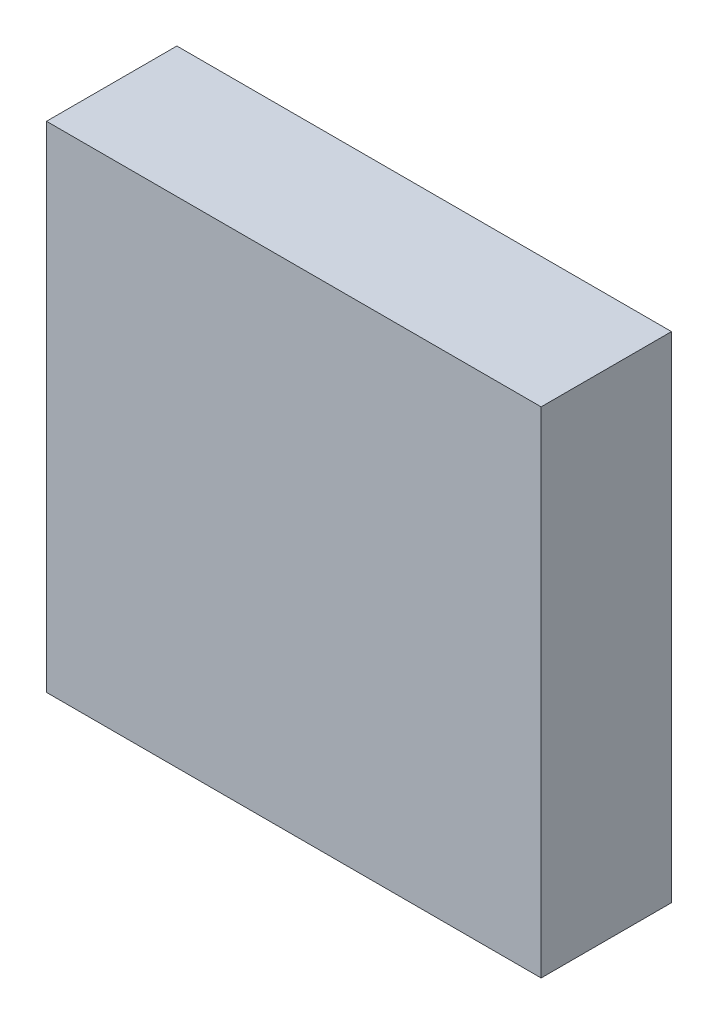
ISO-10303-21;
HEADER;
FILE_DESCRIPTION(('STEP AP214'),'2;1');
FILE_NAME('part.step','',(''),(''),'','','');
FILE_SCHEMA(('AUTOMOTIVE_DESIGN { 1 0 10303 214 1 1 1 1 }'));
ENDSEC;
DATA;
#1=APPLICATION_CONTEXT('core data for automotive mechanical design processes');
#2=APPLICATION_PROTOCOL_DEFINITION('international standard','automotive_design',2000,#1);
#3=PRODUCT_CONTEXT('',#1,'mechanical');
#4=PRODUCT('Part','Part','',(#3));
#5=PRODUCT_RELATED_PRODUCT_CATEGORY('part','',(#4));
#6=PRODUCT_DEFINITION_FORMATION('','',#4);
#7=PRODUCT_DEFINITION_CONTEXT('part definition',#1,'design');
#8=PRODUCT_DEFINITION('design','',#6,#7);
#9=PRODUCT_DEFINITION_SHAPE('','',#8);
#10=(LENGTH_UNIT() NAMED_UNIT(*) SI_UNIT(.MILLI.,.METRE.));
#11=(NAMED_UNIT(*) PLANE_ANGLE_UNIT() SI_UNIT($,.RADIAN.));
#12=(NAMED_UNIT(*) SI_UNIT($,.STERADIAN.) SOLID_ANGLE_UNIT());
#13=UNCERTAINTY_MEASURE_WITH_UNIT(LENGTH_MEASURE(1.E-05),#10,'distance_accuracy_value','');
#14=(GEOMETRIC_REPRESENTATION_CONTEXT(3) GLOBAL_UNCERTAINTY_ASSIGNED_CONTEXT((#13)) GLOBAL_UNIT_ASSIGNED_CONTEXT((#10,
#11,#12)) REPRESENTATION_CONTEXT('',''));
#15=CARTESIAN_POINT('',(0.,0.,0.));
#16=DIRECTION('',(0.,0.,1.));
#17=DIRECTION('',(1.,0.,0.));
#18=AXIS2_PLACEMENT_3D('',#15,#16,#17);
#19=CARTESIAN_POINT('',(0.,0.,1.));
#20=DIRECTION('',(1.,0.,0.));
#21=DIRECTION('',(0.,0.,-1.));
#22=AXIS2_PLACEMENT_3D('',#19,#20,#21);
#23=PLANE('',#22);
#24=DIRECTION('',(0.,-1.,0.));
#25=VECTOR('',#24,1.);
#26=CARTESIAN_POINT('',(0.,0.,0.));
#27=LINE('',#26,#25);
#28=CARTESIAN_POINT('',(0.,3.7941,0.));
#29=VERTEX_POINT('',#28);
#30=CARTESIAN_POINT('',(0.,0.,0.));
#31=VERTEX_POINT('',#30);
#32=EDGE_CURVE('E95',#29,#31,#27,.T.);
#33=ORIENTED_EDGE('',*,*,#32,.T.);
#34=DIRECTION('',(0.,0.,-1.));
#35=VECTOR('',#34,1.);
#36=CARTESIAN_POINT('',(0.,0.,1.));
#37=LINE('',#36,#35);
#38=CARTESIAN_POINT('',(0.,0.,1.));
#39=VERTEX_POINT('',#38);
#40=EDGE_CURVE('E11',#39,#31,#37,.T.);
#41=ORIENTED_EDGE('',*,*,#40,.F.);
#42=DIRECTION('',(0.,-1.,0.));
#43=VECTOR('',#42,1.);
#44=CARTESIAN_POINT('',(0.,0.,1.));
#45=LINE('',#44,#43);
#46=CARTESIAN_POINT('',(0.,3.7941,1.));
#47=VERTEX_POINT('',#46);
#48=EDGE_CURVE('E83',#47,#39,#45,.T.);
#49=ORIENTED_EDGE('',*,*,#48,.F.);
#50=DIRECTION('',(0.,0.,-1.));
#51=VECTOR('',#50,1.);
#52=CARTESIAN_POINT('',(0.,3.7941,1.));
#53=LINE('',#52,#51);
#54=EDGE_CURVE('E91',#47,#29,#53,.T.);
#55=ORIENTED_EDGE('',*,*,#54,.T.);
#56=EDGE_LOOP('',(#33,#41,#49,#55));
#57=FACE_BOUND('',#56,.T.);
#58=ADVANCED_FACE('F32',(#57),#23,.F.);
#59=CARTESIAN_POINT('',(3.7941,0.,1.));
#60=DIRECTION('',(0.,1.,0.));
#61=DIRECTION('',(0.,0.,1.));
#62=AXIS2_PLACEMENT_3D('',#59,#60,#61);
#63=PLANE('',#62);
#64=DIRECTION('',(1.,0.,0.));
#65=VECTOR('',#64,1.);
#66=CARTESIAN_POINT('',(3.7941,0.,0.));
#67=LINE('',#66,#65);
#68=CARTESIAN_POINT('',(3.7941,0.,0.));
#69=VERTEX_POINT('',#68);
#70=EDGE_CURVE('E87',#31,#69,#67,.T.);
#71=ORIENTED_EDGE('',*,*,#70,.T.);
#72=DIRECTION('',(0.,0.,-1.));
#73=VECTOR('',#72,1.);
#74=CARTESIAN_POINT('',(3.7941,0.,1.));
#75=LINE('',#74,#73);
#76=CARTESIAN_POINT('',(3.7941,0.,1.));
#77=VERTEX_POINT('',#76);
#78=EDGE_CURVE('E40',#77,#69,#75,.T.);
#79=ORIENTED_EDGE('',*,*,#78,.F.);
#80=DIRECTION('',(1.,0.,0.));
#81=VECTOR('',#80,1.);
#82=CARTESIAN_POINT('',(3.7941,0.,1.));
#83=LINE('',#82,#81);
#84=EDGE_CURVE('E78',#39,#77,#83,.T.);
#85=ORIENTED_EDGE('',*,*,#84,.F.);
#86=ORIENTED_EDGE('',*,*,#40,.T.);
#87=EDGE_LOOP('',(#71,#79,#85,#86));
#88=FACE_BOUND('',#87,.T.);
#89=ADVANCED_FACE('F86',(#88),#63,.F.);
#90=CARTESIAN_POINT('',(3.7941,3.7941,1.));
#91=DIRECTION('',(-1.,0.,0.));
#92=DIRECTION('',(0.,0.,1.));
#93=AXIS2_PLACEMENT_3D('',#90,#91,#92);
#94=PLANE('',#93);
#95=DIRECTION('',(0.,1.,0.));
#96=VECTOR('',#95,1.);
#97=CARTESIAN_POINT('',(3.7941,3.7941,0.));
#98=LINE('',#97,#96);
#99=CARTESIAN_POINT('',(3.7941,3.7941,0.));
#100=VERTEX_POINT('',#99);
#101=EDGE_CURVE('E65',#69,#100,#98,.T.);
#102=ORIENTED_EDGE('',*,*,#101,.T.);
#103=DIRECTION('',(0.,0.,-1.));
#104=VECTOR('',#103,1.);
#105=CARTESIAN_POINT('',(3.7941,3.7941,1.));
#106=LINE('',#105,#104);
#107=CARTESIAN_POINT('',(3.7941,3.7941,1.));
#108=VERTEX_POINT('',#107);
#109=EDGE_CURVE('E88',#108,#100,#106,.T.);
#110=ORIENTED_EDGE('',*,*,#109,.F.);
#111=DIRECTION('',(0.,1.,0.));
#112=VECTOR('',#111,1.);
#113=CARTESIAN_POINT('',(3.7941,3.7941,1.));
#114=LINE('',#113,#112);
#115=EDGE_CURVE('E81',#77,#108,#114,.T.);
#116=ORIENTED_EDGE('',*,*,#115,.F.);
#117=ORIENTED_EDGE('',*,*,#78,.T.);
#118=EDGE_LOOP('',(#102,#110,#116,#117));
#119=FACE_BOUND('',#118,.T.);
#120=ADVANCED_FACE('F89',(#119),#94,.F.);
#121=CARTESIAN_POINT('',(0.,3.7941,1.));
#122=DIRECTION('',(0.,-1.,0.));
#123=DIRECTION('',(0.,0.,-1.));
#124=AXIS2_PLACEMENT_3D('',#121,#122,#123);
#125=PLANE('',#124);
#126=DIRECTION('',(-1.,0.,0.));
#127=VECTOR('',#126,1.);
#128=CARTESIAN_POINT('',(0.,3.7941,0.));
#129=LINE('',#128,#127);
#130=EDGE_CURVE('E71',#100,#29,#129,.T.);
#131=ORIENTED_EDGE('',*,*,#130,.T.);
#132=ORIENTED_EDGE('',*,*,#54,.F.);
#133=DIRECTION('',(-1.,0.,0.));
#134=VECTOR('',#133,1.);
#135=CARTESIAN_POINT('',(0.,3.7941,1.));
#136=LINE('',#135,#134);
#137=EDGE_CURVE('E48',#108,#47,#136,.T.);
#138=ORIENTED_EDGE('',*,*,#137,.F.);
#139=ORIENTED_EDGE('',*,*,#109,.T.);
#140=EDGE_LOOP('',(#131,#132,#138,#139));
#141=FACE_BOUND('',#140,.T.);
#142=ADVANCED_FACE('F102',(#141),#125,.F.);
#143=CARTESIAN_POINT('',(0.,0.,1.));
#144=DIRECTION('',(0.,0.,-1.));
#145=DIRECTION('',(-1.,0.,0.));
#146=AXIS2_PLACEMENT_3D('',#143,#144,#145);
#147=PLANE('',#146);
#148=ORIENTED_EDGE('',*,*,#48,.T.);
#149=ORIENTED_EDGE('',*,*,#84,.T.);
#150=ORIENTED_EDGE('',*,*,#115,.T.);
#151=ORIENTED_EDGE('',*,*,#137,.T.);
#152=EDGE_LOOP('',(#148,#149,#150,#151));
#153=FACE_BOUND('',#152,.T.);
#154=ADVANCED_FACE('F79',(#153),#147,.F.);
#155=CARTESIAN_POINT('',(0.,0.,0.));
#156=DIRECTION('',(0.,0.,-1.));
#157=DIRECTION('',(-1.,0.,0.));
#158=AXIS2_PLACEMENT_3D('',#155,#156,#157);
#159=PLANE('',#158);
#160=ORIENTED_EDGE('',*,*,#32,.F.);
#161=ORIENTED_EDGE('',*,*,#130,.F.);
#162=ORIENTED_EDGE('',*,*,#101,.F.);
#163=ORIENTED_EDGE('',*,*,#70,.F.);
#164=EDGE_LOOP('',(#160,#161,#162,#163));
#165=FACE_BOUND('',#164,.T.);
#166=ADVANCED_FACE('F105',(#165),#159,.T.);
#167=CLOSED_SHELL('',(#58,#89,#120,#142,#154,#166));
#168=MANIFOLD_SOLID_BREP('B2',#167);
#169=ADVANCED_BREP_SHAPE_REPRESENTATION('',(#18,#168),#14);
#170=SHAPE_DEFINITION_REPRESENTATION(#9,#169);
ENDSEC;
END-ISO-10303-21;
